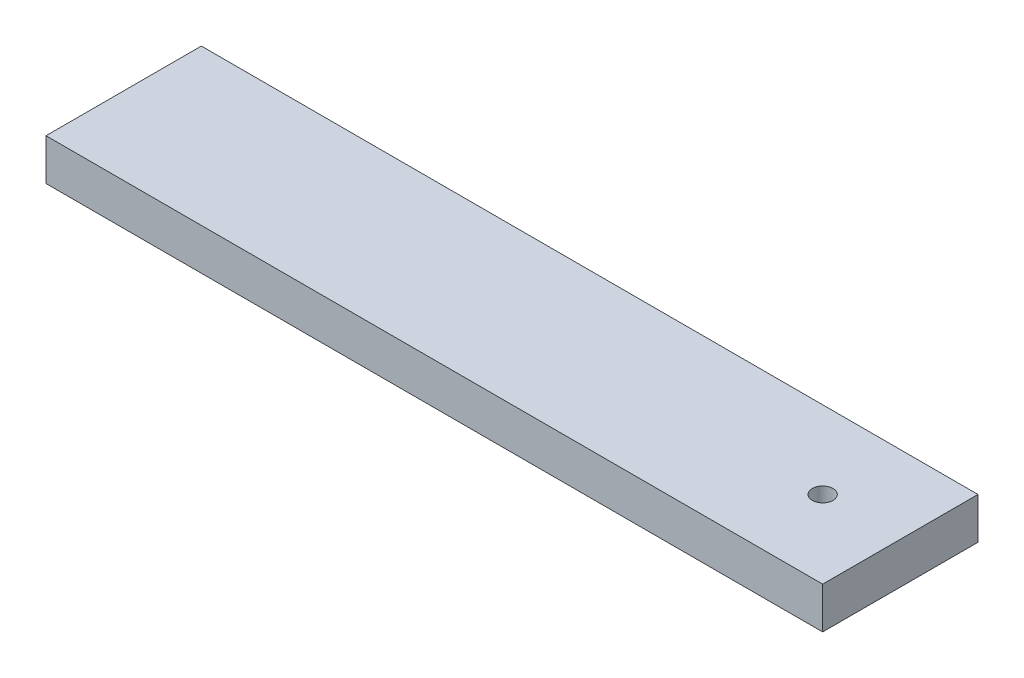
ISO-10303-21;
HEADER;
FILE_DESCRIPTION(('STEP AP214'),'2;1');
FILE_NAME('part.step','',(''),(''),'','','');
FILE_SCHEMA(('AUTOMOTIVE_DESIGN { 1 0 10303 214 1 1 1 1 }'));
ENDSEC;
DATA;
#1=APPLICATION_CONTEXT('core data for automotive mechanical design processes');
#2=APPLICATION_PROTOCOL_DEFINITION('international standard','automotive_design',2000,#1);
#3=PRODUCT_CONTEXT('',#1,'mechanical');
#4=PRODUCT('Part','Part','',(#3));
#5=PRODUCT_RELATED_PRODUCT_CATEGORY('part','',(#4));
#6=PRODUCT_DEFINITION_FORMATION('','',#4);
#7=PRODUCT_DEFINITION_CONTEXT('part definition',#1,'design');
#8=PRODUCT_DEFINITION('design','',#6,#7);
#9=PRODUCT_DEFINITION_SHAPE('','',#8);
#10=(LENGTH_UNIT() NAMED_UNIT(*) SI_UNIT(.MILLI.,.METRE.));
#11=(NAMED_UNIT(*) PLANE_ANGLE_UNIT() SI_UNIT($,.RADIAN.));
#12=(NAMED_UNIT(*) SI_UNIT($,.STERADIAN.) SOLID_ANGLE_UNIT());
#13=UNCERTAINTY_MEASURE_WITH_UNIT(LENGTH_MEASURE(1.E-05),#10,'distance_accuracy_value','');
#14=(GEOMETRIC_REPRESENTATION_CONTEXT(3) GLOBAL_UNCERTAINTY_ASSIGNED_CONTEXT((#13)) GLOBAL_UNIT_ASSIGNED_CONTEXT((#10,
#11,#12)) REPRESENTATION_CONTEXT('',''));
#15=CARTESIAN_POINT('',(0.,0.,0.));
#16=DIRECTION('',(0.,0.,1.));
#17=DIRECTION('',(1.,0.,0.));
#18=AXIS2_PLACEMENT_3D('',#15,#16,#17);
#19=CARTESIAN_POINT('',(0.,8.,0.));
#20=DIRECTION('',(0.,1.,0.));
#21=DIRECTION('',(0.,0.,1.));
#22=AXIS2_PLACEMENT_3D('',#19,#20,#21);
#23=PLANE('',#22);
#24=DIRECTION('',(0.,0.,-1.));
#25=VECTOR('',#24,1.);
#26=CARTESIAN_POINT('',(75.,8.,-15.));
#27=LINE('',#26,#25);
#28=CARTESIAN_POINT('',(75.,8.,15.));
#29=VERTEX_POINT('',#28);
#30=CARTESIAN_POINT('',(75.,8.,-15.));
#31=VERTEX_POINT('',#30);
#32=EDGE_CURVE('E85',#29,#31,#27,.T.);
#33=ORIENTED_EDGE('',*,*,#32,.T.);
#34=DIRECTION('',(-1.,0.,0.));
#35=VECTOR('',#34,1.);
#36=CARTESIAN_POINT('',(-75.,8.,-15.));
#37=LINE('',#36,#35);
#38=CARTESIAN_POINT('',(-75.,8.,-15.));
#39=VERTEX_POINT('',#38);
#40=EDGE_CURVE('E80',#31,#39,#37,.T.);
#41=ORIENTED_EDGE('',*,*,#40,.T.);
#42=DIRECTION('',(0.,0.,1.));
#43=VECTOR('',#42,1.);
#44=CARTESIAN_POINT('',(-75.,8.,-15.));
#45=LINE('',#44,#43);
#46=CARTESIAN_POINT('',(-75.,8.,15.));
#47=VERTEX_POINT('',#46);
#48=EDGE_CURVE('E83',#39,#47,#45,.T.);
#49=ORIENTED_EDGE('',*,*,#48,.T.);
#50=DIRECTION('',(1.,0.,0.));
#51=VECTOR('',#50,1.);
#52=CARTESIAN_POINT('',(-75.,8.,15.));
#53=LINE('',#52,#51);
#54=EDGE_CURVE('E50',#47,#29,#53,.T.);
#55=ORIENTED_EDGE('',*,*,#54,.T.);
#56=EDGE_LOOP('',(#33,#41,#49,#55));
#57=FACE_BOUND('',#56,.T.);
#58=CARTESIAN_POINT('',(60.,8.,0.));
#59=DIRECTION('',(0.,1.,0.));
#60=DIRECTION('',(0.,0.,1.));
#61=AXIS2_PLACEMENT_3D('',#58,#59,#60);
#62=CIRCLE('',#61,2.);
#63=CARTESIAN_POINT('',(60.,8.,2.));
#64=VERTEX_POINT('',#63);
#65=EDGE_CURVE('E100',#64,#64,#62,.T.);
#66=ORIENTED_EDGE('',*,*,#65,.F.);
#67=EDGE_LOOP('',(#66));
#68=FACE_BOUND('',#67,.T.);
#69=ADVANCED_FACE('F33',(#57,#68),#23,.T.);
#70=CARTESIAN_POINT('',(0.,0.,0.));
#71=DIRECTION('',(0.,1.,0.));
#72=DIRECTION('',(0.,0.,1.));
#73=AXIS2_PLACEMENT_3D('',#70,#71,#72);
#74=PLANE('',#73);
#75=DIRECTION('',(0.,0.,-1.));
#76=VECTOR('',#75,1.);
#77=CARTESIAN_POINT('',(75.,0.,-15.));
#78=LINE('',#77,#76);
#79=CARTESIAN_POINT('',(75.,0.,15.));
#80=VERTEX_POINT('',#79);
#81=CARTESIAN_POINT('',(75.,0.,-15.));
#82=VERTEX_POINT('',#81);
#83=EDGE_CURVE('E97',#80,#82,#78,.T.);
#84=ORIENTED_EDGE('',*,*,#83,.F.);
#85=DIRECTION('',(1.,0.,0.));
#86=VECTOR('',#85,1.);
#87=CARTESIAN_POINT('',(-75.,0.,15.));
#88=LINE('',#87,#86);
#89=CARTESIAN_POINT('',(-75.,0.,15.));
#90=VERTEX_POINT('',#89);
#91=EDGE_CURVE('E73',#90,#80,#88,.T.);
#92=ORIENTED_EDGE('',*,*,#91,.F.);
#93=DIRECTION('',(0.,0.,1.));
#94=VECTOR('',#93,1.);
#95=CARTESIAN_POINT('',(-75.,0.,-15.));
#96=LINE('',#95,#94);
#97=CARTESIAN_POINT('',(-75.,0.,-15.));
#98=VERTEX_POINT('',#97);
#99=EDGE_CURVE('E67',#98,#90,#96,.T.);
#100=ORIENTED_EDGE('',*,*,#99,.F.);
#101=DIRECTION('',(-1.,0.,0.));
#102=VECTOR('',#101,1.);
#103=CARTESIAN_POINT('',(-75.,0.,-15.));
#104=LINE('',#103,#102);
#105=EDGE_CURVE('E89',#82,#98,#104,.T.);
#106=ORIENTED_EDGE('',*,*,#105,.F.);
#107=EDGE_LOOP('',(#84,#92,#100,#106));
#108=FACE_BOUND('',#107,.T.);
#109=CARTESIAN_POINT('',(60.,0.,0.));
#110=DIRECTION('',(0.,1.,0.));
#111=DIRECTION('',(0.,0.,1.));
#112=AXIS2_PLACEMENT_3D('',#109,#110,#111);
#113=CIRCLE('',#112,2.);
#114=CARTESIAN_POINT('',(60.,0.,2.));
#115=VERTEX_POINT('',#114);
#116=EDGE_CURVE('E112',#115,#115,#113,.T.);
#117=ORIENTED_EDGE('',*,*,#116,.T.);
#118=EDGE_LOOP('',(#117));
#119=FACE_BOUND('',#118,.T.);
#120=ADVANCED_FACE('F108',(#108,#119),#74,.F.);
#121=CARTESIAN_POINT('',(75.,8.,-15.));
#122=DIRECTION('',(-1.,0.,0.));
#123=DIRECTION('',(0.,0.,1.));
#124=AXIS2_PLACEMENT_3D('',#121,#122,#123);
#125=PLANE('',#124);
#126=ORIENTED_EDGE('',*,*,#83,.T.);
#127=DIRECTION('',(0.,-1.,0.));
#128=VECTOR('',#127,1.);
#129=CARTESIAN_POINT('',(75.,8.,-15.));
#130=LINE('',#129,#128);
#131=EDGE_CURVE('E11',#31,#82,#130,.T.);
#132=ORIENTED_EDGE('',*,*,#131,.F.);
#133=ORIENTED_EDGE('',*,*,#32,.F.);
#134=DIRECTION('',(0.,-1.,0.));
#135=VECTOR('',#134,1.);
#136=CARTESIAN_POINT('',(75.,8.,15.));
#137=LINE('',#136,#135);
#138=EDGE_CURVE('E93',#29,#80,#137,.T.);
#139=ORIENTED_EDGE('',*,*,#138,.T.);
#140=EDGE_LOOP('',(#126,#132,#133,#139));
#141=FACE_BOUND('',#140,.T.);
#142=ADVANCED_FACE('F35',(#141),#125,.F.);
#143=CARTESIAN_POINT('',(-75.,8.,-15.));
#144=DIRECTION('',(0.,0.,1.));
#145=DIRECTION('',(1.,0.,0.));
#146=AXIS2_PLACEMENT_3D('',#143,#144,#145);
#147=PLANE('',#146);
#148=ORIENTED_EDGE('',*,*,#105,.T.);
#149=DIRECTION('',(0.,-1.,0.));
#150=VECTOR('',#149,1.);
#151=CARTESIAN_POINT('',(-75.,8.,-15.));
#152=LINE('',#151,#150);
#153=EDGE_CURVE('E42',#39,#98,#152,.T.);
#154=ORIENTED_EDGE('',*,*,#153,.F.);
#155=ORIENTED_EDGE('',*,*,#40,.F.);
#156=ORIENTED_EDGE('',*,*,#131,.T.);
#157=EDGE_LOOP('',(#148,#154,#155,#156));
#158=FACE_BOUND('',#157,.T.);
#159=ADVANCED_FACE('F88',(#158),#147,.F.);
#160=CARTESIAN_POINT('',(-75.,8.,-15.));
#161=DIRECTION('',(1.,0.,0.));
#162=DIRECTION('',(0.,0.,-1.));
#163=AXIS2_PLACEMENT_3D('',#160,#161,#162);
#164=PLANE('',#163);
#165=ORIENTED_EDGE('',*,*,#99,.T.);
#166=DIRECTION('',(0.,-1.,0.));
#167=VECTOR('',#166,1.);
#168=CARTESIAN_POINT('',(-75.,8.,15.));
#169=LINE('',#168,#167);
#170=EDGE_CURVE('E90',#47,#90,#169,.T.);
#171=ORIENTED_EDGE('',*,*,#170,.F.);
#172=ORIENTED_EDGE('',*,*,#48,.F.);
#173=ORIENTED_EDGE('',*,*,#153,.T.);
#174=EDGE_LOOP('',(#165,#171,#172,#173));
#175=FACE_BOUND('',#174,.T.);
#176=ADVANCED_FACE('F91',(#175),#164,.F.);
#177=CARTESIAN_POINT('',(-75.,8.,15.));
#178=DIRECTION('',(0.,0.,-1.));
#179=DIRECTION('',(-1.,0.,0.));
#180=AXIS2_PLACEMENT_3D('',#177,#178,#179);
#181=PLANE('',#180);
#182=ORIENTED_EDGE('',*,*,#91,.T.);
#183=ORIENTED_EDGE('',*,*,#138,.F.);
#184=ORIENTED_EDGE('',*,*,#54,.F.);
#185=ORIENTED_EDGE('',*,*,#170,.T.);
#186=EDGE_LOOP('',(#182,#183,#184,#185));
#187=FACE_BOUND('',#186,.T.);
#188=ADVANCED_FACE('F105',(#187),#181,.F.);
#189=CARTESIAN_POINT('',(60.,8.,0.));
#190=DIRECTION('',(0.,-1.,0.));
#191=DIRECTION('',(0.,0.,-1.));
#192=AXIS2_PLACEMENT_3D('',#189,#190,#191);
#193=CYLINDRICAL_SURFACE('',#192,2.);
#194=ORIENTED_EDGE('',*,*,#65,.T.);
#195=EDGE_LOOP('',(#194));
#196=FACE_BOUND('',#195,.T.);
#197=ORIENTED_EDGE('',*,*,#116,.F.);
#198=EDGE_LOOP('',(#197));
#199=FACE_BOUND('',#198,.T.);
#200=ADVANCED_FACE('F118',(#196,#199),#193,.F.);
#201=CLOSED_SHELL('',(#69,#120,#142,#159,#176,#188,#200));
#202=MANIFOLD_SOLID_BREP('B2',#201);
#203=ADVANCED_BREP_SHAPE_REPRESENTATION('',(#18,#202),#14);
#204=SHAPE_DEFINITION_REPRESENTATION(#9,#203);
ENDSEC;
END-ISO-10303-21;
